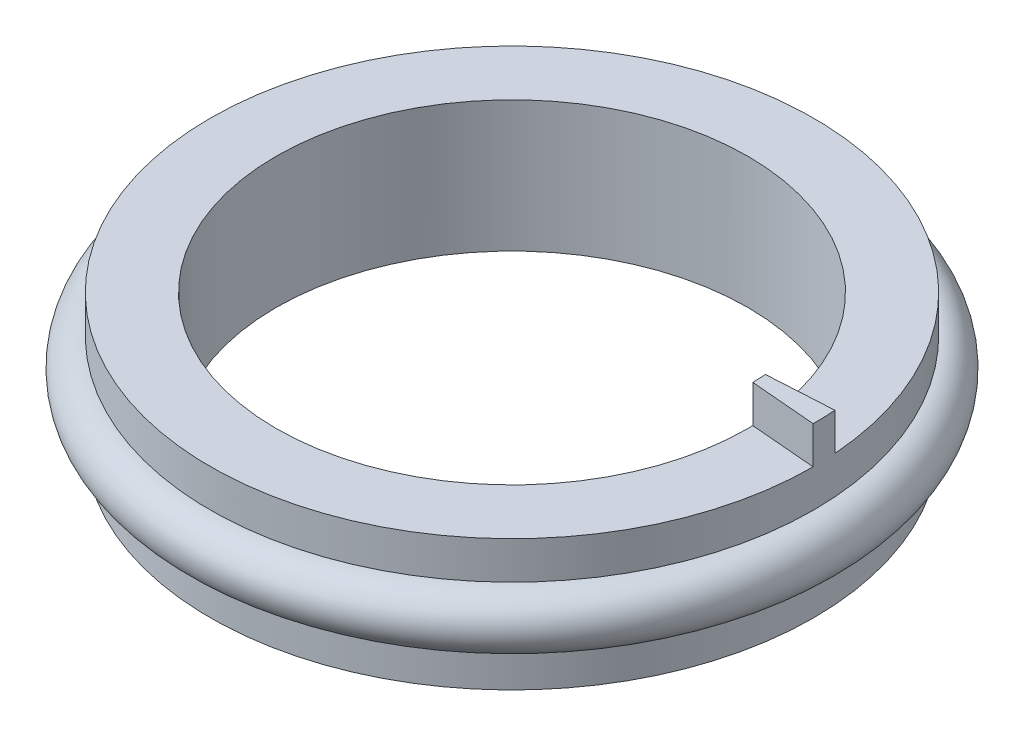
ISO-10303-21;
HEADER;
FILE_DESCRIPTION(('STEP AP214'),'2;1');
FILE_NAME('part.step','',(''),(''),'','','');
FILE_SCHEMA(('AUTOMOTIVE_DESIGN { 1 0 10303 214 1 1 1 1 }'));
ENDSEC;
DATA;
#1=APPLICATION_CONTEXT('core data for automotive mechanical design processes');
#2=APPLICATION_PROTOCOL_DEFINITION('international standard','automotive_design',2000,#1);
#3=PRODUCT_CONTEXT('',#1,'mechanical');
#4=PRODUCT('Part','Part','',(#3));
#5=PRODUCT_RELATED_PRODUCT_CATEGORY('part','',(#4));
#6=PRODUCT_DEFINITION_FORMATION('','',#4);
#7=PRODUCT_DEFINITION_CONTEXT('part definition',#1,'design');
#8=PRODUCT_DEFINITION('design','',#6,#7);
#9=PRODUCT_DEFINITION_SHAPE('','',#8);
#10=(LENGTH_UNIT() NAMED_UNIT(*) SI_UNIT(.MILLI.,.METRE.));
#11=(NAMED_UNIT(*) PLANE_ANGLE_UNIT() SI_UNIT($,.RADIAN.));
#12=(NAMED_UNIT(*) SI_UNIT($,.STERADIAN.) SOLID_ANGLE_UNIT());
#13=UNCERTAINTY_MEASURE_WITH_UNIT(LENGTH_MEASURE(1.E-05),#10,'distance_accuracy_value','');
#14=(GEOMETRIC_REPRESENTATION_CONTEXT(3) GLOBAL_UNCERTAINTY_ASSIGNED_CONTEXT((#13)) GLOBAL_UNIT_ASSIGNED_CONTEXT((#10,
#11,#12)) REPRESENTATION_CONTEXT('',''));
#15=CARTESIAN_POINT('',(0.,0.,0.));
#16=DIRECTION('',(0.,0.,1.));
#17=DIRECTION('',(1.,0.,0.));
#18=AXIS2_PLACEMENT_3D('',#15,#16,#17);
#19=CARTESIAN_POINT('',(4.59637729376451E-13,-133.995441592069,0.));
#20=DIRECTION('',(0.,-1.,0.));
#21=DIRECTION('',(1.,0.,0.));
#22=AXIS2_PLACEMENT_3D('',#19,#20,#21);
#23=CYLINDRICAL_SURFACE('',#22,6.3);
#24=CARTESIAN_POINT('',(0.,-1.35907258064519,0.));
#25=DIRECTION('',(0.,-1.,0.));
#26=DIRECTION('',(1.,0.,0.));
#27=AXIS2_PLACEMENT_3D('',#24,#25,#26);
#28=CIRCLE('',#27,6.29999999999999);
#29=CARTESIAN_POINT('',(6.3,-1.35907258064517,0.));
#30=VERTEX_POINT('',#29);
#31=EDGE_CURVE('E101',#30,#30,#28,.T.);
#32=ORIENTED_EDGE('',*,*,#31,.T.);
#33=EDGE_LOOP('',(#32));
#34=FACE_BOUND('',#33,.T.);
#35=CARTESIAN_POINT('',(0.,2.14092741935482,0.));
#36=DIRECTION('',(0.,-1.,0.));
#37=DIRECTION('',(1.,0.,0.));
#38=AXIS2_PLACEMENT_3D('',#35,#36,#37);
#39=CIRCLE('',#38,6.30000000000001);
#40=CARTESIAN_POINT('',(6.29858304083192,2.14092741935484,-0.133610170812581));
#41=VERTEX_POINT('',#40);
#42=CARTESIAN_POINT('',(6.28130564092736,2.14092741935484,-0.484973654185606));
#43=VERTEX_POINT('',#42);
#44=EDGE_CURVE('E11',#41,#43,#39,.T.);
#45=ORIENTED_EDGE('',*,*,#44,.F.);
#46=DIRECTION('',(0.,-1.,0.));
#47=VECTOR('',#46,1.);
#48=CARTESIAN_POINT('',(6.29858304083191,3.14092741935484,-0.13361017081258));
#49=LINE('',#48,#47);
#50=CARTESIAN_POINT('',(6.29858304083191,3.14092741935484,-0.13361017081258));
#51=VERTEX_POINT('',#50);
#52=EDGE_CURVE('E82',#51,#41,#49,.T.);
#53=ORIENTED_EDGE('',*,*,#52,.F.);
#54=CARTESIAN_POINT('',(0.,3.14092741935481,0.));
#55=DIRECTION('',(0.,-1.,0.));
#56=DIRECTION('',(1.,0.,0.));
#57=AXIS2_PLACEMENT_3D('',#54,#55,#56);
#58=CIRCLE('',#57,6.30000000000001);
#59=CARTESIAN_POINT('',(6.28130564092736,3.14092741935484,-0.484973654185606));
#60=VERTEX_POINT('',#59);
#61=EDGE_CURVE('E89',#60,#51,#58,.T.);
#62=ORIENTED_EDGE('',*,*,#61,.F.);
#63=DIRECTION('',(0.,-1.,0.));
#64=VECTOR('',#63,1.);
#65=CARTESIAN_POINT('',(6.28130564092736,3.14092741935484,-0.484973654185606));
#66=LINE('',#65,#64);
#67=EDGE_CURVE('E131',#60,#43,#66,.T.);
#68=ORIENTED_EDGE('',*,*,#67,.T.);
#69=EDGE_LOOP('',(#45,#53,#62,#68));
#70=FACE_BOUND('',#69,.T.);
#71=ADVANCED_FACE('F39',(#34,#70),#23,.F.);
#72=CARTESIAN_POINT('',(6.3,2.14092741935484,0.));
#73=DIRECTION('',(0.,1.,0.));
#74=DIRECTION('',(-1.,0.,0.));
#75=AXIS2_PLACEMENT_3D('',#72,#73,#74);
#76=PLANE('',#75);
#77=DIRECTION('',(-0.998356271063048,0.,0.057312791147237));
#78=VECTOR('',#77,1.);
#79=CARTESIAN_POINT('',(6.28130564092736,2.14092741935484,-0.484973654185606));
#80=LINE('',#79,#78);
#81=CARTESIAN_POINT('',(8.03867953475921,2.14092741935484,-0.58585948609163));
#82=VERTEX_POINT('',#81);
#83=EDGE_CURVE('E53',#82,#43,#80,.T.);
#84=ORIENTED_EDGE('',*,*,#83,.F.);
#85=CARTESIAN_POINT('',(0.,2.14092741935482,0.));
#86=DIRECTION('',(0.,-1.,0.));
#87=DIRECTION('',(1.,0.,0.));
#88=AXIS2_PLACEMENT_3D('',#85,#86,#87);
#89=CIRCLE('',#88,8.06000000000001);
#90=CARTESIAN_POINT('',(8.05998493353111,2.14092741935484,0.015584327111228));
#91=VERTEX_POINT('',#90);
#92=EDGE_CURVE('E47',#91,#82,#89,.T.);
#93=ORIENTED_EDGE('',*,*,#92,.F.);
#94=DIRECTION('',(0.9964319619059,0.,0.0843999128693865));
#95=VECTOR('',#94,1.);
#96=CARTESIAN_POINT('',(6.29858304083192,2.14092741935484,-0.13361017081258));
#97=LINE('',#96,#95);
#98=EDGE_CURVE('E58',#41,#91,#97,.T.);
#99=ORIENTED_EDGE('',*,*,#98,.F.);
#100=ORIENTED_EDGE('',*,*,#44,.T.);
#101=EDGE_LOOP('',(#84,#93,#99,#100));
#102=FACE_BOUND('',#101,.T.);
#103=ADVANCED_FACE('F152',(#102),#76,.T.);
#104=CARTESIAN_POINT('',(4.59637729376451E-13,-133.995441592069,0.));
#105=DIRECTION('',(0.,-1.,0.));
#106=DIRECTION('',(1.,0.,0.));
#107=AXIS2_PLACEMENT_3D('',#104,#105,#106);
#108=CYLINDRICAL_SURFACE('',#107,8.06000000000001);
#109=ORIENTED_EDGE('',*,*,#92,.T.);
#110=DIRECTION('',(0.,-1.,0.));
#111=VECTOR('',#110,1.);
#112=CARTESIAN_POINT('',(8.0386795347592,3.14092741935484,-0.58585948609163));
#113=LINE('',#112,#111);
#114=CARTESIAN_POINT('',(8.0386795347592,3.14092741935484,-0.58585948609163));
#115=VERTEX_POINT('',#114);
#116=EDGE_CURVE('E108',#115,#82,#113,.T.);
#117=ORIENTED_EDGE('',*,*,#116,.F.);
#118=CARTESIAN_POINT('',(0.,3.14092741935481,0.));
#119=DIRECTION('',(0.,1.,0.));
#120=DIRECTION('',(1.,0.,0.));
#121=AXIS2_PLACEMENT_3D('',#118,#119,#120);
#122=CIRCLE('',#121,8.06000000000001);
#123=CARTESIAN_POINT('',(8.05998493353111,3.14092741935484,0.015584327111228));
#124=VERTEX_POINT('',#123);
#125=EDGE_CURVE('E88',#124,#115,#122,.T.);
#126=ORIENTED_EDGE('',*,*,#125,.F.);
#127=DIRECTION('',(0.,-1.,0.));
#128=VECTOR('',#127,1.);
#129=CARTESIAN_POINT('',(8.05998493353111,3.14092741935484,0.015584327111228));
#130=LINE('',#129,#128);
#131=EDGE_CURVE('E84',#124,#91,#130,.T.);
#132=ORIENTED_EDGE('',*,*,#131,.T.);
#133=EDGE_LOOP('',(#109,#117,#126,#132));
#134=FACE_BOUND('',#133,.T.);
#135=CARTESIAN_POINT('',(0.,1.13446503040188,0.));
#136=DIRECTION('',(0.,-1.,0.));
#137=DIRECTION('',(1.,0.,0.));
#138=AXIS2_PLACEMENT_3D('',#135,#136,#137);
#139=CIRCLE('',#138,8.06);
#140=CARTESIAN_POINT('',(8.06,1.1344650304019,0.));
#141=VERTEX_POINT('',#140);
#142=EDGE_CURVE('E119',#141,#141,#139,.T.);
#143=ORIENTED_EDGE('',*,*,#142,.F.);
#144=EDGE_LOOP('',(#143));
#145=FACE_BOUND('',#144,.T.);
#146=ADVANCED_FACE('F126',(#134,#145),#108,.T.);
#147=CARTESIAN_POINT('',(0.,0.390927419354811,0.));
#148=DIRECTION('',(0.,-1.,0.));
#149=DIRECTION('',(1.,0.,0.));
#150=AXIS2_PLACEMENT_3D('',#147,#148,#149);
#151=TOROIDAL_SURFACE('',#150,8.06,0.743537611047069);
#152=ORIENTED_EDGE('',*,*,#142,.T.);
#153=EDGE_LOOP('',(#152));
#154=FACE_BOUND('',#153,.T.);
#155=CARTESIAN_POINT('',(0.,-0.352610191692249,0.));
#156=DIRECTION('',(0.,-1.,0.));
#157=DIRECTION('',(1.,0.,0.));
#158=AXIS2_PLACEMENT_3D('',#155,#156,#157);
#159=CIRCLE('',#158,8.06);
#160=CARTESIAN_POINT('',(8.06,-0.352610191692221,0.));
#161=VERTEX_POINT('',#160);
#162=EDGE_CURVE('E115',#161,#161,#159,.T.);
#163=ORIENTED_EDGE('',*,*,#162,.F.);
#164=EDGE_LOOP('',(#163));
#165=FACE_BOUND('',#164,.T.);
#166=ADVANCED_FACE('F166',(#154,#165),#151,.T.);
#167=CARTESIAN_POINT('',(4.59637729376451E-13,-133.995441592069,0.));
#168=DIRECTION('',(0.,-1.,0.));
#169=DIRECTION('',(1.,0.,0.));
#170=AXIS2_PLACEMENT_3D('',#167,#168,#169);
#171=CYLINDRICAL_SURFACE('',#170,8.06);
#172=ORIENTED_EDGE('',*,*,#162,.T.);
#173=EDGE_LOOP('',(#172));
#174=FACE_BOUND('',#173,.T.);
#175=CARTESIAN_POINT('',(0.,-1.35907258064519,0.));
#176=DIRECTION('',(0.,-1.,0.));
#177=DIRECTION('',(1.,0.,0.));
#178=AXIS2_PLACEMENT_3D('',#175,#176,#177);
#179=CIRCLE('',#178,8.06);
#180=CARTESIAN_POINT('',(8.06,-1.35907258064516,0.));
#181=VERTEX_POINT('',#180);
#182=EDGE_CURVE('E106',#181,#181,#179,.T.);
#183=ORIENTED_EDGE('',*,*,#182,.F.);
#184=EDGE_LOOP('',(#183));
#185=FACE_BOUND('',#184,.T.);
#186=ADVANCED_FACE('F160',(#174,#185),#171,.T.);
#187=CARTESIAN_POINT('',(6.3,-1.35907258064516,0.));
#188=DIRECTION('',(0.,-1.,0.));
#189=DIRECTION('',(1.,0.,0.));
#190=AXIS2_PLACEMENT_3D('',#187,#188,#189);
#191=PLANE('',#190);
#192=ORIENTED_EDGE('',*,*,#182,.T.);
#193=EDGE_LOOP('',(#192));
#194=FACE_BOUND('',#193,.T.);
#195=ORIENTED_EDGE('',*,*,#31,.F.);
#196=EDGE_LOOP('',(#195));
#197=FACE_BOUND('',#196,.T.);
#198=ADVANCED_FACE('F149',(#194,#197),#191,.T.);
#199=CARTESIAN_POINT('',(6.29858304083191,3.14092741935484,-0.13361017081258));
#200=DIRECTION('',(0.0843999128693865,0.,-0.9964319619059));
#201=DIRECTION('',(-0.996431961905899,0.,-0.0843999128693865));
#202=AXIS2_PLACEMENT_3D('',#199,#200,#201);
#203=PLANE('',#202);
#204=ORIENTED_EDGE('',*,*,#98,.T.);
#205=ORIENTED_EDGE('',*,*,#131,.F.);
#206=DIRECTION('',(0.9964319619059,0.,0.0843999128693865));
#207=VECTOR('',#206,1.);
#208=CARTESIAN_POINT('',(6.29858304083191,3.14092741935484,-0.13361017081258));
#209=LINE('',#208,#207);
#210=EDGE_CURVE('E78',#51,#124,#209,.T.);
#211=ORIENTED_EDGE('',*,*,#210,.F.);
#212=ORIENTED_EDGE('',*,*,#52,.T.);
#213=EDGE_LOOP('',(#204,#205,#211,#212));
#214=FACE_BOUND('',#213,.T.);
#215=ADVANCED_FACE('F80',(#214),#203,.F.);
#216=CARTESIAN_POINT('',(6.28130564092736,3.14092741935484,-0.484973654185606));
#217=DIRECTION('',(0.057312791147237,0.,0.998356271063047));
#218=DIRECTION('',(0.998356271063048,0.,-0.057312791147237));
#219=AXIS2_PLACEMENT_3D('',#216,#217,#218);
#220=PLANE('',#219);
#221=ORIENTED_EDGE('',*,*,#83,.T.);
#222=ORIENTED_EDGE('',*,*,#67,.F.);
#223=DIRECTION('',(-0.998356271063048,0.,0.057312791147237));
#224=VECTOR('',#223,1.);
#225=CARTESIAN_POINT('',(6.28130564092736,3.14092741935484,-0.484973654185606));
#226=LINE('',#225,#224);
#227=EDGE_CURVE('E94',#115,#60,#226,.T.);
#228=ORIENTED_EDGE('',*,*,#227,.F.);
#229=ORIENTED_EDGE('',*,*,#116,.T.);
#230=EDGE_LOOP('',(#221,#222,#228,#229));
#231=FACE_BOUND('',#230,.T.);
#232=ADVANCED_FACE('F129',(#231),#220,.F.);
#233=CARTESIAN_POINT('',(0.,3.14092741935481,0.));
#234=DIRECTION('',(0.,-1.,0.));
#235=DIRECTION('',(1.,0.,0.));
#236=AXIS2_PLACEMENT_3D('',#233,#234,#235);
#237=PLANE('',#236);
#238=ORIENTED_EDGE('',*,*,#61,.T.);
#239=ORIENTED_EDGE('',*,*,#210,.T.);
#240=ORIENTED_EDGE('',*,*,#125,.T.);
#241=ORIENTED_EDGE('',*,*,#227,.T.);
#242=EDGE_LOOP('',(#238,#239,#240,#241));
#243=FACE_BOUND('',#242,.T.);
#244=ADVANCED_FACE('F92',(#243),#237,.F.);
#245=CLOSED_SHELL('',(#71,#103,#146,#166,#186,#198,#215,#232,#244));
#246=MANIFOLD_SOLID_BREP('B2',#245);
#247=ADVANCED_BREP_SHAPE_REPRESENTATION('',(#18,#246),#14);
#248=SHAPE_DEFINITION_REPRESENTATION(#9,#247);
ENDSEC;
END-ISO-10303-21;
